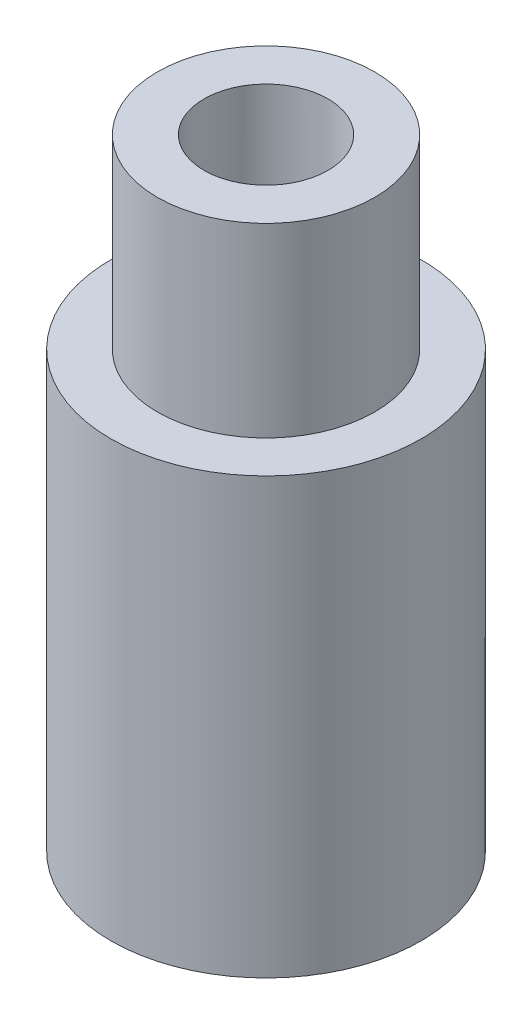
ISO-10303-21;
HEADER;
FILE_DESCRIPTION(('STEP AP214'),'2;1');
FILE_NAME('part.step','',(''),(''),'','','');
FILE_SCHEMA(('AUTOMOTIVE_DESIGN { 1 0 10303 214 1 1 1 1 }'));
ENDSEC;
DATA;
#1=APPLICATION_CONTEXT('core data for automotive mechanical design processes');
#2=APPLICATION_PROTOCOL_DEFINITION('international standard','automotive_design',2000,#1);
#3=PRODUCT_CONTEXT('',#1,'mechanical');
#4=PRODUCT('Part','Part','',(#3));
#5=PRODUCT_RELATED_PRODUCT_CATEGORY('part','',(#4));
#6=PRODUCT_DEFINITION_FORMATION('','',#4);
#7=PRODUCT_DEFINITION_CONTEXT('part definition',#1,'design');
#8=PRODUCT_DEFINITION('design','',#6,#7);
#9=PRODUCT_DEFINITION_SHAPE('','',#8);
#10=(LENGTH_UNIT() NAMED_UNIT(*) SI_UNIT(.MILLI.,.METRE.));
#11=(NAMED_UNIT(*) PLANE_ANGLE_UNIT() SI_UNIT($,.RADIAN.));
#12=(NAMED_UNIT(*) SI_UNIT($,.STERADIAN.) SOLID_ANGLE_UNIT());
#13=UNCERTAINTY_MEASURE_WITH_UNIT(LENGTH_MEASURE(1.E-05),#10,'distance_accuracy_value','');
#14=(GEOMETRIC_REPRESENTATION_CONTEXT(3) GLOBAL_UNCERTAINTY_ASSIGNED_CONTEXT((#13)) GLOBAL_UNIT_ASSIGNED_CONTEXT((#10,
#11,#12)) REPRESENTATION_CONTEXT('',''));
#15=CARTESIAN_POINT('',(0.,0.,0.));
#16=DIRECTION('',(0.,0.,1.));
#17=DIRECTION('',(1.,0.,0.));
#18=AXIS2_PLACEMENT_3D('',#15,#16,#17);
#19=CARTESIAN_POINT('',(0.,0.,0.));
#20=DIRECTION('',(0.,1.,0.));
#21=DIRECTION('',(0.,0.,1.));
#22=AXIS2_PLACEMENT_3D('',#19,#20,#21);
#23=CYLINDRICAL_SURFACE('',#22,0.99949);
#24=CARTESIAN_POINT('',(0.,10.0076,0.));
#25=DIRECTION('',(0.,1.,0.));
#26=DIRECTION('',(0.,0.,1.));
#27=AXIS2_PLACEMENT_3D('',#24,#25,#26);
#28=CIRCLE('',#27,0.99949);
#29=CARTESIAN_POINT('',(0.,10.0076,0.99949));
#30=VERTEX_POINT('',#29);
#31=EDGE_CURVE('E55',#30,#30,#28,.T.);
#32=ORIENTED_EDGE('',*,*,#31,.T.);
#33=EDGE_LOOP('',(#32));
#34=FACE_BOUND('',#33,.T.);
#35=CARTESIAN_POINT('',(0.,6.985,0.));
#36=DIRECTION('',(0.,-1.,0.));
#37=DIRECTION('',(0.,0.,-1.));
#38=AXIS2_PLACEMENT_3D('',#35,#36,#37);
#39=CIRCLE('',#38,0.99949);
#40=CARTESIAN_POINT('',(0.,6.985,-0.99949));
#41=VERTEX_POINT('',#40);
#42=EDGE_CURVE('E37',#41,#41,#39,.F.);
#43=ORIENTED_EDGE('',*,*,#42,.F.);
#44=EDGE_LOOP('',(#43));
#45=FACE_BOUND('',#44,.T.);
#46=ADVANCED_FACE('F33',(#34,#45),#23,.F.);
#47=CARTESIAN_POINT('',(0.,7.0104,0.));
#48=DIRECTION('',(0.,-1.,0.));
#49=DIRECTION('',(0.,0.,-1.));
#50=AXIS2_PLACEMENT_3D('',#47,#48,#49);
#51=CYLINDRICAL_SURFACE('',#50,2.5019);
#52=CARTESIAN_POINT('',(0.,7.0104,0.));
#53=DIRECTION('',(0.,1.,0.));
#54=DIRECTION('',(0.,0.,1.));
#55=AXIS2_PLACEMENT_3D('',#52,#53,#54);
#56=CIRCLE('',#55,2.5019);
#57=CARTESIAN_POINT('',(0.,7.0104,2.5019));
#58=VERTEX_POINT('',#57);
#59=EDGE_CURVE('E41',#58,#58,#56,.T.);
#60=ORIENTED_EDGE('',*,*,#59,.F.);
#61=EDGE_LOOP('',(#60));
#62=FACE_BOUND('',#61,.T.);
#63=CARTESIAN_POINT('',(0.,0.,0.));
#64=DIRECTION('',(0.,1.,0.));
#65=DIRECTION('',(0.,0.,1.));
#66=AXIS2_PLACEMENT_3D('',#63,#64,#65);
#67=CIRCLE('',#66,2.5019);
#68=CARTESIAN_POINT('',(0.,0.,2.5019));
#69=VERTEX_POINT('',#68);
#70=EDGE_CURVE('E46',#69,#69,#67,.T.);
#71=ORIENTED_EDGE('',*,*,#70,.T.);
#72=EDGE_LOOP('',(#71));
#73=FACE_BOUND('',#72,.T.);
#74=ADVANCED_FACE('F35',(#62,#73),#51,.T.);
#75=CARTESIAN_POINT('',(0.,7.0104,0.));
#76=DIRECTION('',(0.,1.,0.));
#77=DIRECTION('',(0.,0.,1.));
#78=AXIS2_PLACEMENT_3D('',#75,#76,#77);
#79=PLANE('',#78);
#80=CARTESIAN_POINT('',(0.,7.0104,0.));
#81=DIRECTION('',(0.,1.,0.));
#82=DIRECTION('',(0.,0.,1.));
#83=AXIS2_PLACEMENT_3D('',#80,#81,#82);
#84=CIRCLE('',#83,1.7526);
#85=CARTESIAN_POINT('',(0.,7.0104,-1.7526));
#86=VERTEX_POINT('',#85);
#87=EDGE_CURVE('E10',#86,#86,#84,.T.);
#88=ORIENTED_EDGE('',*,*,#87,.F.);
#89=EDGE_LOOP('',(#88));
#90=FACE_BOUND('',#89,.T.);
#91=ORIENTED_EDGE('',*,*,#59,.T.);
#92=EDGE_LOOP('',(#91));
#93=FACE_BOUND('',#92,.T.);
#94=ADVANCED_FACE('F83',(#90,#93),#79,.T.);
#95=CARTESIAN_POINT('',(0.,0.,0.));
#96=DIRECTION('',(0.,1.,0.));
#97=DIRECTION('',(0.,0.,1.));
#98=AXIS2_PLACEMENT_3D('',#95,#96,#97);
#99=PLANE('',#98);
#100=CARTESIAN_POINT('',(0.,0.,0.));
#101=DIRECTION('',(0.,-1.,0.));
#102=DIRECTION('',(0.,0.,-1.));
#103=AXIS2_PLACEMENT_3D('',#100,#101,#102);
#104=CIRCLE('',#103,1.9939);
#105=CARTESIAN_POINT('',(0.,0.,-1.9939));
#106=VERTEX_POINT('',#105);
#107=EDGE_CURVE('E64',#106,#106,#104,.T.);
#108=ORIENTED_EDGE('',*,*,#107,.F.);
#109=EDGE_LOOP('',(#108));
#110=FACE_BOUND('',#109,.T.);
#111=ORIENTED_EDGE('',*,*,#70,.F.);
#112=EDGE_LOOP('',(#111));
#113=FACE_BOUND('',#112,.T.);
#114=ADVANCED_FACE('F79',(#110,#113),#99,.F.);
#115=CARTESIAN_POINT('',(0.,10.0076,0.));
#116=DIRECTION('',(0.,-1.,0.));
#117=DIRECTION('',(0.,0.,-1.));
#118=AXIS2_PLACEMENT_3D('',#115,#116,#117);
#119=CYLINDRICAL_SURFACE('',#118,1.7526);
#120=CARTESIAN_POINT('',(0.,10.0076,0.));
#121=DIRECTION('',(0.,1.,0.));
#122=DIRECTION('',(0.,0.,1.));
#123=AXIS2_PLACEMENT_3D('',#120,#121,#122);
#124=CIRCLE('',#123,1.7526);
#125=CARTESIAN_POINT('',(0.,10.0076,-1.7526));
#126=VERTEX_POINT('',#125);
#127=EDGE_CURVE('E49',#126,#126,#124,.T.);
#128=CARTESIAN_POINT('',(0.,10.0076,-1.7526));
#129=CARTESIAN_POINT('',(0.,9.97637916666667,-1.7526));
#130=CARTESIAN_POINT('',(0.,9.94515833333333,-1.7526));
#131=CARTESIAN_POINT('',(0.,9.88271666666667,-1.7526));
#132=CARTESIAN_POINT('',(0.,9.85149583333333,-1.7526));
#133=CARTESIAN_POINT('',(0.,9.78905416666667,-1.7526));
#134=CARTESIAN_POINT('',(0.,9.75783333333333,-1.7526));
#135=CARTESIAN_POINT('',(0.,9.69539166666667,-1.7526));
#136=CARTESIAN_POINT('',(0.,9.66417083333333,-1.7526));
#137=CARTESIAN_POINT('',(0.,9.60172916666667,-1.7526));
#138=CARTESIAN_POINT('',(0.,9.57050833333333,-1.7526));
#139=CARTESIAN_POINT('',(0.,9.50806666666667,-1.7526));
#140=CARTESIAN_POINT('',(0.,9.47684583333333,-1.7526));
#141=CARTESIAN_POINT('',(0.,9.41440416666667,-1.7526));
#142=CARTESIAN_POINT('',(0.,9.38318333333333,-1.7526));
#143=CARTESIAN_POINT('',(0.,9.32074166666667,-1.7526));
#144=CARTESIAN_POINT('',(0.,9.28952083333333,-1.7526));
#145=CARTESIAN_POINT('',(0.,9.22707916666667,-1.7526));
#146=CARTESIAN_POINT('',(0.,9.19585833333333,-1.7526));
#147=CARTESIAN_POINT('',(0.,9.13341666666667,-1.7526));
#148=CARTESIAN_POINT('',(0.,9.10219583333333,-1.7526));
#149=CARTESIAN_POINT('',(0.,9.03975416666666,-1.7526));
#150=CARTESIAN_POINT('',(0.,9.00853333333333,-1.7526));
#151=CARTESIAN_POINT('',(0.,8.94609166666667,-1.7526));
#152=CARTESIAN_POINT('',(0.,8.91487083333333,-1.7526));
#153=CARTESIAN_POINT('',(0.,8.85242916666667,-1.7526));
#154=CARTESIAN_POINT('',(0.,8.82120833333333,-1.7526));
#155=CARTESIAN_POINT('',(0.,8.75876666666667,-1.7526));
#156=CARTESIAN_POINT('',(0.,8.72754583333333,-1.7526));
#157=CARTESIAN_POINT('',(0.,8.66510416666667,-1.7526));
#158=CARTESIAN_POINT('',(0.,8.63388333333333,-1.7526));
#159=CARTESIAN_POINT('',(0.,8.57144166666667,-1.7526));
#160=CARTESIAN_POINT('',(0.,8.54022083333333,-1.7526));
#161=CARTESIAN_POINT('',(0.,8.47777916666667,-1.7526));
#162=CARTESIAN_POINT('',(0.,8.44655833333333,-1.7526));
#163=CARTESIAN_POINT('',(0.,8.38411666666667,-1.7526));
#164=CARTESIAN_POINT('',(0.,8.35289583333333,-1.7526));
#165=CARTESIAN_POINT('',(0.,8.29045416666666,-1.7526));
#166=CARTESIAN_POINT('',(0.,8.25923333333333,-1.7526));
#167=CARTESIAN_POINT('',(0.,8.19679166666667,-1.7526));
#168=CARTESIAN_POINT('',(0.,8.16557083333333,-1.7526));
#169=CARTESIAN_POINT('',(0.,8.10312916666667,-1.7526));
#170=CARTESIAN_POINT('',(0.,8.07190833333333,-1.7526));
#171=CARTESIAN_POINT('',(0.,8.00946666666667,-1.7526));
#172=CARTESIAN_POINT('',(0.,7.97824583333333,-1.7526));
#173=CARTESIAN_POINT('',(0.,7.91580416666667,-1.7526));
#174=CARTESIAN_POINT('',(0.,7.88458333333333,-1.7526));
#175=CARTESIAN_POINT('',(0.,7.82214166666667,-1.7526));
#176=CARTESIAN_POINT('',(0.,7.79092083333333,-1.7526));
#177=CARTESIAN_POINT('',(0.,7.72847916666667,-1.7526));
#178=CARTESIAN_POINT('',(0.,7.69725833333333,-1.7526));
#179=CARTESIAN_POINT('',(0.,7.63481666666667,-1.7526));
#180=CARTESIAN_POINT('',(0.,7.60359583333333,-1.7526));
#181=CARTESIAN_POINT('',(0.,7.54115416666667,-1.7526));
#182=CARTESIAN_POINT('',(0.,7.50993333333333,-1.7526));
#183=CARTESIAN_POINT('',(0.,7.44749166666667,-1.7526));
#184=CARTESIAN_POINT('',(0.,7.41627083333333,-1.7526));
#185=CARTESIAN_POINT('',(0.,7.35382916666667,-1.7526));
#186=CARTESIAN_POINT('',(0.,7.32260833333333,-1.7526));
#187=CARTESIAN_POINT('',(0.,7.26016666666667,-1.7526));
#188=CARTESIAN_POINT('',(0.,7.22894583333333,-1.7526));
#189=CARTESIAN_POINT('',(0.,7.16650416666667,-1.7526));
#190=CARTESIAN_POINT('',(0.,7.13528333333333,-1.7526));
#191=CARTESIAN_POINT('',(0.,7.07284166666667,-1.7526));
#192=CARTESIAN_POINT('',(0.,7.04162083333333,-1.7526));
#193=CARTESIAN_POINT('',(0.,7.0104,-1.7526));
#194=B_SPLINE_CURVE_WITH_KNOTS('',3,(#128,#129,#130,#131,#132,#133,#134,#135,#136,#137,#138,
#139,#140,#141,#142,#143,#144,#145,#146,#147,#148,#149,#150,#151,#152,#153,#154,#155,#156,#157,
#158,#159,#160,#161,#162,#163,#164,#165,#166,#167,#168,#169,#170,#171,#172,#173,#174,#175,#176,
#177,#178,#179,#180,#181,#182,#183,#184,#185,#186,#187,#188,#189,#190,#191,#192,#193),
.UNSPECIFIED.,.F.,.F.,(4,2,2,2,2,2,2,2,2,2,2,2,2,2,2,2,2,2,2,2,2,2,2,2,2,2,2,2,2,2,2,2,4),(0.,
0.093662500000001,0.187325,0.280987500000001,0.374650000000001,0.4683125,0.561975000000001,
0.6556375,0.749300000000001,0.842962500000001,0.936625000000002,1.0302875,1.12395,1.2176125,
1.311275,1.4049375,1.4986,1.5922625,1.685925,1.7795875,1.87325,1.9669125,2.060575,2.1542375,
2.2479,2.3415625,2.435225,2.5288875,2.62255,2.7162125,2.809875,2.9035375,2.9972),.UNSPECIFIED.);
#195=EDGE_CURVE('BSEAM82',#126,#86,#194,.T.);
#196=ORIENTED_EDGE('',*,*,#127,.F.);
#197=ORIENTED_EDGE('',*,*,#87,.T.);
#198=ORIENTED_EDGE('',*,*,#195,.T.);
#199=ORIENTED_EDGE('',*,*,#195,.F.);
#200=EDGE_LOOP('',(#196,#198,#197,#199));
#201=FACE_BOUND('',#200,.T.);
#202=ADVANCED_FACE('F82',(#201),#119,.T.);
#203=CARTESIAN_POINT('',(0.,10.0076,0.));
#204=DIRECTION('',(0.,1.,0.));
#205=DIRECTION('',(0.,0.,1.));
#206=AXIS2_PLACEMENT_3D('',#203,#204,#205);
#207=PLANE('',#206);
#208=ORIENTED_EDGE('',*,*,#31,.F.);
#209=EDGE_LOOP('',(#208));
#210=FACE_BOUND('',#209,.T.);
#211=ORIENTED_EDGE('',*,*,#127,.T.);
#212=EDGE_LOOP('',(#211));
#213=FACE_BOUND('',#212,.T.);
#214=ADVANCED_FACE('F88',(#210,#213),#207,.T.);
#215=CARTESIAN_POINT('',(0.,6.985,0.));
#216=DIRECTION('',(0.,-1.,0.));
#217=DIRECTION('',(0.,0.,-1.));
#218=AXIS2_PLACEMENT_3D('',#215,#216,#217);
#219=PLANE('',#218);
#220=CARTESIAN_POINT('',(0.,6.985,0.));
#221=DIRECTION('',(0.,-1.,0.));
#222=DIRECTION('',(0.,0.,-1.));
#223=AXIS2_PLACEMENT_3D('',#220,#221,#222);
#224=CIRCLE('',#223,1.9939);
#225=CARTESIAN_POINT('',(0.,6.985,-1.9939));
#226=VERTEX_POINT('',#225);
#227=EDGE_CURVE('E62',#226,#226,#224,.T.);
#228=ORIENTED_EDGE('',*,*,#227,.T.);
#229=EDGE_LOOP('',(#228));
#230=FACE_BOUND('',#229,.T.);
#231=ORIENTED_EDGE('',*,*,#42,.T.);
#232=EDGE_LOOP('',(#231));
#233=FACE_BOUND('',#232,.T.);
#234=ADVANCED_FACE('F70',(#230,#233),#219,.T.);
#235=CARTESIAN_POINT('',(0.,6.985,0.));
#236=DIRECTION('',(0.,-1.,0.));
#237=DIRECTION('',(0.,0.,-1.));
#238=AXIS2_PLACEMENT_3D('',#235,#236,#237);
#239=CYLINDRICAL_SURFACE('',#238,1.9939);
#240=ORIENTED_EDGE('',*,*,#227,.F.);
#241=EDGE_LOOP('',(#240));
#242=FACE_BOUND('',#241,.T.);
#243=ORIENTED_EDGE('',*,*,#107,.T.);
#244=EDGE_LOOP('',(#243));
#245=FACE_BOUND('',#244,.T.);
#246=ADVANCED_FACE('F73',(#242,#245),#239,.F.);
#247=CLOSED_SHELL('',(#46,#74,#94,#114,#202,#214,#234,#246));
#248=MANIFOLD_SOLID_BREP('B2',#247);
#249=ADVANCED_BREP_SHAPE_REPRESENTATION('',(#18,#248),#14);
#250=SHAPE_DEFINITION_REPRESENTATION(#9,#249);
ENDSEC;
END-ISO-10303-21;
